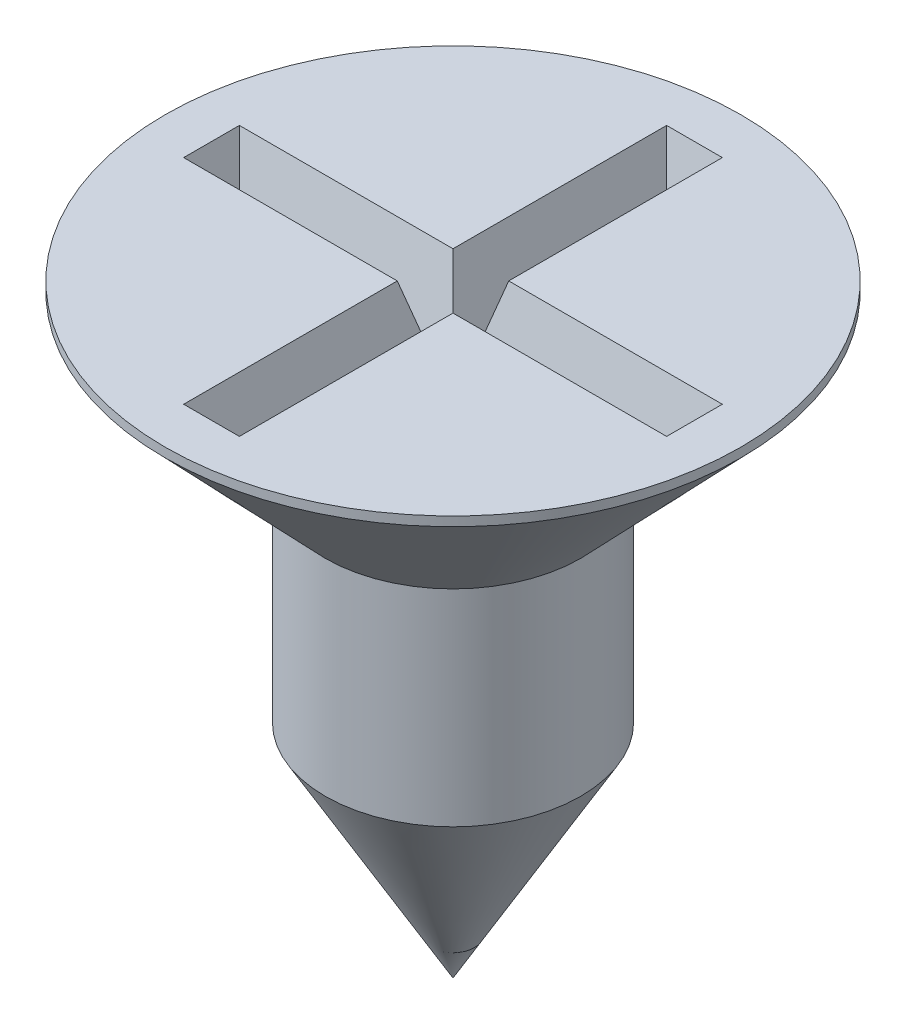
ISO-10303-21;
HEADER;
FILE_DESCRIPTION(('STEP AP214'),'2;1');
FILE_NAME('part.step','',(''),(''),'','','');
FILE_SCHEMA(('AUTOMOTIVE_DESIGN { 1 0 10303 214 1 1 1 1 }'));
ENDSEC;
DATA;
#1=APPLICATION_CONTEXT('core data for automotive mechanical design processes');
#2=APPLICATION_PROTOCOL_DEFINITION('international standard','automotive_design',2000,#1);
#3=PRODUCT_CONTEXT('',#1,'mechanical');
#4=PRODUCT('Part','Part','',(#3));
#5=PRODUCT_RELATED_PRODUCT_CATEGORY('part','',(#4));
#6=PRODUCT_DEFINITION_FORMATION('','',#4);
#7=PRODUCT_DEFINITION_CONTEXT('part definition',#1,'design');
#8=PRODUCT_DEFINITION('design','',#6,#7);
#9=PRODUCT_DEFINITION_SHAPE('','',#8);
#10=(LENGTH_UNIT() NAMED_UNIT(*) SI_UNIT(.MILLI.,.METRE.));
#11=(NAMED_UNIT(*) PLANE_ANGLE_UNIT() SI_UNIT($,.RADIAN.));
#12=(NAMED_UNIT(*) SI_UNIT($,.STERADIAN.) SOLID_ANGLE_UNIT());
#13=UNCERTAINTY_MEASURE_WITH_UNIT(LENGTH_MEASURE(1.E-05),#10,'distance_accuracy_value','');
#14=(GEOMETRIC_REPRESENTATION_CONTEXT(3) GLOBAL_UNCERTAINTY_ASSIGNED_CONTEXT((#13)) GLOBAL_UNIT_ASSIGNED_CONTEXT((#10,
#11,#12)) REPRESENTATION_CONTEXT('',''));
#15=CARTESIAN_POINT('',(0.,0.,0.));
#16=DIRECTION('',(0.,0.,1.));
#17=DIRECTION('',(1.,0.,0.));
#18=AXIS2_PLACEMENT_3D('',#15,#16,#17);
#19=CARTESIAN_POINT('',(0.,6.5,0.));
#20=DIRECTION('',(0.,-1.,0.));
#21=DIRECTION('',(0.,0.,-1.));
#22=AXIS2_PLACEMENT_3D('',#19,#20,#21);
#23=PLANE('',#22);
#24=DIRECTION('',(-1.,0.,0.));
#25=VECTOR('',#24,1.);
#26=CARTESIAN_POINT('',(5.19999999999999,6.5,-0.6));
#27=LINE('',#26,#25);
#28=CARTESIAN_POINT('',(5.19999999999999,6.5,-0.6));
#29=VERTEX_POINT('',#28);
#30=CARTESIAN_POINT('',(0.599999999999999,6.5,-0.6));
#31=VERTEX_POINT('',#30);
#32=EDGE_CURVE('E178',#29,#31,#27,.T.);
#33=ORIENTED_EDGE('',*,*,#32,.F.);
#34=DIRECTION('',(0.,0.,-1.));
#35=VECTOR('',#34,1.);
#36=CARTESIAN_POINT('',(5.19999999999999,6.5,-0.6));
#37=LINE('',#36,#35);
#38=CARTESIAN_POINT('',(5.19999999999999,6.5,0.6));
#39=VERTEX_POINT('',#38);
#40=EDGE_CURVE('E59',#39,#29,#37,.T.);
#41=ORIENTED_EDGE('',*,*,#40,.F.);
#42=DIRECTION('',(1.,0.,0.));
#43=VECTOR('',#42,1.);
#44=CARTESIAN_POINT('',(5.19999999999999,6.5,0.6));
#45=LINE('',#44,#43);
#46=CARTESIAN_POINT('',(0.599999999999999,6.5,0.6));
#47=VERTEX_POINT('',#46);
#48=EDGE_CURVE('E222',#47,#39,#45,.T.);
#49=ORIENTED_EDGE('',*,*,#48,.F.);
#50=DIRECTION('',(0.,0.,-1.));
#51=VECTOR('',#50,1.);
#52=CARTESIAN_POINT('',(0.6,6.5,5.19999999999999));
#53=LINE('',#52,#51);
#54=CARTESIAN_POINT('',(0.6,6.5,5.19999999999999));
#55=VERTEX_POINT('',#54);
#56=EDGE_CURVE('E218',#55,#47,#53,.T.);
#57=ORIENTED_EDGE('',*,*,#56,.F.);
#58=DIRECTION('',(1.,0.,0.));
#59=VECTOR('',#58,1.);
#60=CARTESIAN_POINT('',(0.6,6.5,5.19999999999999));
#61=LINE('',#60,#59);
#62=CARTESIAN_POINT('',(-0.6,6.5,5.19999999999999));
#63=VERTEX_POINT('',#62);
#64=EDGE_CURVE('E214',#63,#55,#61,.T.);
#65=ORIENTED_EDGE('',*,*,#64,.F.);
#66=DIRECTION('',(0.,0.,1.));
#67=VECTOR('',#66,1.);
#68=CARTESIAN_POINT('',(-0.6,6.5,5.19999999999999));
#69=LINE('',#68,#67);
#70=CARTESIAN_POINT('',(-0.6,6.5,0.6));
#71=VERTEX_POINT('',#70);
#72=EDGE_CURVE('E210',#71,#63,#69,.T.);
#73=ORIENTED_EDGE('',*,*,#72,.F.);
#74=DIRECTION('',(1.,0.,0.));
#75=VECTOR('',#74,1.);
#76=CARTESIAN_POINT('',(-0.6,6.5,0.6));
#77=LINE('',#76,#75);
#78=CARTESIAN_POINT('',(-5.19999999999999,6.5,0.6));
#79=VERTEX_POINT('',#78);
#80=EDGE_CURVE('E206',#79,#71,#77,.T.);
#81=ORIENTED_EDGE('',*,*,#80,.F.);
#82=DIRECTION('',(0.,0.,1.));
#83=VECTOR('',#82,1.);
#84=CARTESIAN_POINT('',(-5.19999999999999,6.5,-0.6));
#85=LINE('',#84,#83);
#86=CARTESIAN_POINT('',(-5.19999999999999,6.5,-0.6));
#87=VERTEX_POINT('',#86);
#88=EDGE_CURVE('E202',#87,#79,#85,.T.);
#89=ORIENTED_EDGE('',*,*,#88,.F.);
#90=DIRECTION('',(-1.,0.,0.));
#91=VECTOR('',#90,1.);
#92=CARTESIAN_POINT('',(-0.600000000000001,6.5,-0.6));
#93=LINE('',#92,#91);
#94=CARTESIAN_POINT('',(-0.600000000000001,6.5,-0.6));
#95=VERTEX_POINT('',#94);
#96=EDGE_CURVE('E198',#95,#87,#93,.T.);
#97=ORIENTED_EDGE('',*,*,#96,.F.);
#98=DIRECTION('',(0.,0.,1.));
#99=VECTOR('',#98,1.);
#100=CARTESIAN_POINT('',(-0.600000000000001,6.5,-0.6));
#101=LINE('',#100,#99);
#102=CARTESIAN_POINT('',(-0.600000000000001,6.5,-5.19999999999999));
#103=VERTEX_POINT('',#102);
#104=EDGE_CURVE('E191',#103,#95,#101,.T.);
#105=ORIENTED_EDGE('',*,*,#104,.F.);
#106=DIRECTION('',(-1.,0.,0.));
#107=VECTOR('',#106,1.);
#108=CARTESIAN_POINT('',(0.599999999999999,6.5,-5.19999999999999));
#109=LINE('',#108,#107);
#110=CARTESIAN_POINT('',(0.599999999999999,6.5,-5.19999999999999));
#111=VERTEX_POINT('',#110);
#112=EDGE_CURVE('E186',#111,#103,#109,.T.);
#113=ORIENTED_EDGE('',*,*,#112,.F.);
#114=DIRECTION('',(0.,0.,-1.));
#115=VECTOR('',#114,1.);
#116=CARTESIAN_POINT('',(0.599999999999999,6.5,-0.6));
#117=LINE('',#116,#115);
#118=EDGE_CURVE('E167',#31,#111,#117,.T.);
#119=ORIENTED_EDGE('',*,*,#118,.F.);
#120=EDGE_LOOP('',(#33,#41,#49,#57,#65,#73,#81,#89,#97,#105,#113,#119));
#121=FACE_BOUND('',#120,.T.);
#122=CARTESIAN_POINT('',(0.,6.5,0.));
#123=DIRECTION('',(0.,1.,0.));
#124=DIRECTION('',(0.,0.,1.));
#125=AXIS2_PLACEMENT_3D('',#122,#123,#124);
#126=CIRCLE('',#125,6.19999999999999);
#127=CARTESIAN_POINT('',(0.,6.5,6.19999999999999));
#128=VERTEX_POINT('',#127);
#129=EDGE_CURVE('E291',#128,#128,#126,.T.);
#130=ORIENTED_EDGE('',*,*,#129,.T.);
#131=EDGE_LOOP('',(#130));
#132=FACE_BOUND('',#131,.T.);
#133=ADVANCED_FACE('F39',(#121,#132),#23,.F.);
#134=CARTESIAN_POINT('',(0.,6.5,0.));
#135=DIRECTION('',(0.,1.,0.));
#136=DIRECTION('',(0.,0.,1.));
#137=AXIS2_PLACEMENT_3D('',#134,#135,#136);
#138=CYLINDRICAL_SURFACE('',#137,6.19999999999999);
#139=ORIENTED_EDGE('',*,*,#129,.F.);
#140=EDGE_LOOP('',(#139));
#141=FACE_BOUND('',#140,.T.);
#142=CARTESIAN_POINT('',(0.,6.3,0.));
#143=DIRECTION('',(0.,1.,0.));
#144=DIRECTION('',(0.,0.,1.));
#145=AXIS2_PLACEMENT_3D('',#142,#143,#144);
#146=CIRCLE('',#145,6.19999999999999);
#147=CARTESIAN_POINT('',(0.,6.3,6.19999999999999));
#148=VERTEX_POINT('',#147);
#149=EDGE_CURVE('E287',#148,#148,#146,.T.);
#150=ORIENTED_EDGE('',*,*,#149,.T.);
#151=EDGE_LOOP('',(#150));
#152=FACE_BOUND('',#151,.T.);
#153=ADVANCED_FACE('F456',(#141,#152),#138,.T.);
#154=CARTESIAN_POINT('',(0.,2.7,0.));
#155=DIRECTION('',(0.,1.,0.));
#156=DIRECTION('',(0.,0.,1.));
#157=AXIS2_PLACEMENT_3D('',#154,#155,#156);
#158=CONICAL_SURFACE('',#157,2.74999999999999,0.764124777373387);
#159=CARTESIAN_POINT('',(4.56973881140884,4.5998,0.0908429445423794));
#160=CARTESIAN_POINT('',(4.67503828420214,4.71029873744425,0.120450992005224));
#161=CARTESIAN_POINT('',(4.78022645620089,4.82089604868346,0.150085452236824));
#162=CARTESIAN_POINT('',(4.99038018570394,5.04228780515629,0.209407194594628));
#163=CARTESIAN_POINT('',(5.09534574323556,5.1530822503657,0.239094476714344));
#164=CARTESIAN_POINT('',(5.20019999999999,5.26397526934586,0.268808171596327));
#165=B_SPLINE_CURVE_WITH_KNOTS('',3,(#159,#160,#161,#162,#163,#164),.UNSPECIFIED.,.F.,.F.,(4,2,
4),(0.,0.466444704263011,0.93288935123795),.UNSPECIFIED.);
#166=CARTESIAN_POINT('',(4.56992945034698,4.6,0.0908965343808655));
#167=VERTEX_POINT('',#166);
#168=CARTESIAN_POINT('',(4.73827792700708,4.77682976461443,0.138277927007089));
#169=VERTEX_POINT('',#168);
#170=EDGE_CURVE('E52',#167,#169,#165,.T.);
#171=ORIENTED_EDGE('',*,*,#170,.T.);
#172=CARTESIAN_POINT('',(4.75214750465496,4.82859173307583,0.6002));
#173=CARTESIAN_POINT('',(4.74731094026299,4.81054142903092,0.50090084970078));
#174=CARTESIAN_POINT('',(4.74363678763936,4.79682930476477,0.400717092167328));
#175=CARTESIAN_POINT('',(4.73873941003317,4.77855204271462,0.200350434962483));
#176=CARTESIAN_POINT('',(4.7374949943619,4.77390782020372,0.100175217481241));
#177=CARTESIAN_POINT('',(4.7374949943619,4.77390782020372,-0.100175217481241));
#178=CARTESIAN_POINT('',(4.73873941003317,4.77855204271462,-0.200350434962483));
#179=CARTESIAN_POINT('',(4.74363678763936,4.79682930476477,-0.400717092167328));
#180=CARTESIAN_POINT('',(4.74731094026299,4.81054142903092,-0.50090084970078));
#181=CARTESIAN_POINT('',(4.75214750465496,4.82859173307583,-0.6002));
#182=B_SPLINE_CURVE_WITH_KNOTS('',3,(#172,#173,#174,#175,#176,#177,#178,#179,#180,#181),
.UNSPECIFIED.,.F.,.F.,(4,2,2,2,4),(0.,0.303085396279077,0.60351544594977,0.903945495620462,
1.20703089189954),.UNSPECIFIED.);
#183=CARTESIAN_POINT('',(4.73827792700708,4.77682976461443,-0.138277927007089));
#184=VERTEX_POINT('',#183);
#185=EDGE_CURVE('E11',#169,#184,#182,.T.);
#186=ORIENTED_EDGE('',*,*,#185,.T.);
#187=CARTESIAN_POINT('',(5.20019999999999,5.26397526934586,-0.268808171596326));
#188=CARTESIAN_POINT('',(5.09534574323556,5.1530822503657,-0.239094476714344));
#189=CARTESIAN_POINT('',(4.99038018570394,5.04228780515629,-0.209407194594628));
#190=CARTESIAN_POINT('',(4.78022645620089,4.82089604868346,-0.150085452236824));
#191=CARTESIAN_POINT('',(4.67503828420214,4.71029873744425,-0.120450992005224));
#192=CARTESIAN_POINT('',(4.56973881140884,4.5998,-0.0908429445423793));
#193=B_SPLINE_CURVE_WITH_KNOTS('',3,(#187,#188,#189,#190,#191,#192),.UNSPECIFIED.,.F.,.F.,(4,2,
4),(0.,0.466444646974939,0.93288935123795),.UNSPECIFIED.);
#194=CARTESIAN_POINT('',(4.56992945034698,4.6,-0.0908965343808655));
#195=VERTEX_POINT('',#194);
#196=EDGE_CURVE('E400',#184,#195,#193,.T.);
#197=ORIENTED_EDGE('',*,*,#196,.T.);
#198=CARTESIAN_POINT('',(0.,4.6,0.));
#199=DIRECTION('',(0.,-1.,0.));
#200=DIRECTION('',(0.,0.,-1.));
#201=AXIS2_PLACEMENT_3D('',#198,#199,#200);
#202=CIRCLE('',#201,4.57083333333332);
#203=EDGE_CURVE('E299',#195,#167,#202,.T.);
#204=ORIENTED_EDGE('',*,*,#203,.T.);
#205=EDGE_LOOP('',(#171,#186,#197,#204));
#206=FACE_BOUND('',#205,.T.);
#207=CARTESIAN_POINT('',(-0.6002,4.82859173307584,4.75214750465496));
#208=CARTESIAN_POINT('',(-0.50090084970078,4.81054142903094,4.74731094026299));
#209=CARTESIAN_POINT('',(-0.400717092167328,4.79682930476479,4.74363678763936));
#210=CARTESIAN_POINT('',(-0.200350434962482,4.77855204271463,4.73873941003317));
#211=CARTESIAN_POINT('',(-0.100175217481241,4.77390782020374,4.73749499436191));
#212=CARTESIAN_POINT('',(0.100175217481242,4.77390782020374,4.73749499436191));
#213=CARTESIAN_POINT('',(0.200350434962483,4.77855204271463,4.73873941003317));
#214=CARTESIAN_POINT('',(0.400717092167328,4.79682930476479,4.74363678763936));
#215=CARTESIAN_POINT('',(0.500900849700781,4.81054142903093,4.74731094026299));
#216=CARTESIAN_POINT('',(0.6002,4.82859173307584,4.75214750465496));
#217=B_SPLINE_CURVE_WITH_KNOTS('',3,(#207,#208,#209,#210,#211,#212,#213,#214,#215,#216),
.UNSPECIFIED.,.F.,.F.,(4,2,2,2,4),(0.,0.303085396279077,0.60351544594977,0.903945495620462,
1.20703089189954),.UNSPECIFIED.);
#218=CARTESIAN_POINT('',(-0.138277927007092,4.77682976461444,4.73827792700708));
#219=VERTEX_POINT('',#218);
#220=CARTESIAN_POINT('',(0.138277927007092,4.77682976461444,4.73827792700708));
#221=VERTEX_POINT('',#220);
#222=EDGE_CURVE('E385',#219,#221,#217,.T.);
#223=ORIENTED_EDGE('',*,*,#222,.T.);
#224=CARTESIAN_POINT('',(0.268808171596329,5.26397526934587,5.20019999999999));
#225=CARTESIAN_POINT('',(0.239094476714346,5.15308225036571,5.09534574323556));
#226=CARTESIAN_POINT('',(0.20940719459463,5.0422878051563,4.99038018570393));
#227=CARTESIAN_POINT('',(0.150085452236825,4.82089604868346,4.78022645620089));
#228=CARTESIAN_POINT('',(0.120450992005225,4.71029873744425,4.67503828420213));
#229=CARTESIAN_POINT('',(0.0908429445423795,4.5998,4.56973881140884));
#230=B_SPLINE_CURVE_WITH_KNOTS('',3,(#224,#225,#226,#227,#228,#229),.UNSPECIFIED.,.F.,.F.,(4,2,
4),(0.,0.466444646974946,0.932889351237963),.UNSPECIFIED.);
#231=CARTESIAN_POINT('',(0.0908965343808657,4.6,4.56992945034697));
#232=VERTEX_POINT('',#231);
#233=EDGE_CURVE('E393',#221,#232,#230,.T.);
#234=ORIENTED_EDGE('',*,*,#233,.T.);
#235=CARTESIAN_POINT('',(-0.0908965343808655,4.6,4.56992945034697));
#236=VERTEX_POINT('',#235);
#237=EDGE_CURVE('E386',#232,#236,#202,.T.);
#238=ORIENTED_EDGE('',*,*,#237,.T.);
#239=CARTESIAN_POINT('',(-0.0908429445423793,4.5998,4.56973881140884));
#240=CARTESIAN_POINT('',(-0.120450992005225,4.71029873744425,4.67503828420213));
#241=CARTESIAN_POINT('',(-0.150085452236825,4.82089604868346,4.78022645620089));
#242=CARTESIAN_POINT('',(-0.20940719459463,5.0422878051563,4.99038018570393));
#243=CARTESIAN_POINT('',(-0.239094476714346,5.15308225036571,5.09534574323556));
#244=CARTESIAN_POINT('',(-0.268808171596329,5.26397526934587,5.20019999999999));
#245=B_SPLINE_CURVE_WITH_KNOTS('',3,(#239,#240,#241,#242,#243,#244),.UNSPECIFIED.,.F.,.F.,(4,2,
4),(0.,0.466444704263017,0.932889351237963),.UNSPECIFIED.);
#246=EDGE_CURVE('E378',#236,#219,#245,.T.);
#247=ORIENTED_EDGE('',*,*,#246,.T.);
#248=EDGE_LOOP('',(#223,#234,#238,#247));
#249=FACE_BOUND('',#248,.T.);
#250=CARTESIAN_POINT('',(-4.75214750465497,4.82859173307585,-0.6002));
#251=CARTESIAN_POINT('',(-4.747310940263,4.81054142903095,-0.50090084970078));
#252=CARTESIAN_POINT('',(-4.74363678763937,4.7968293047648,-0.400717092167328));
#253=CARTESIAN_POINT('',(-4.73873941003318,4.77855204271465,-0.200350434962483));
#254=CARTESIAN_POINT('',(-4.73749499436191,4.77390782020375,-0.100175217481241));
#255=CARTESIAN_POINT('',(-4.73749499436191,4.77390782020375,0.100175217481241));
#256=CARTESIAN_POINT('',(-4.73873941003318,4.77855204271465,0.200350434962483));
#257=CARTESIAN_POINT('',(-4.74363678763937,4.7968293047648,0.400717092167328));
#258=CARTESIAN_POINT('',(-4.747310940263,4.81054142903095,0.50090084970078));
#259=CARTESIAN_POINT('',(-4.75214750465497,4.82859173307586,0.6002));
#260=B_SPLINE_CURVE_WITH_KNOTS('',3,(#250,#251,#252,#253,#254,#255,#256,#257,#258,#259),
.UNSPECIFIED.,.F.,.F.,(4,2,2,2,4),(0.,0.303085396279077,0.603515445949769,0.903945495620462,
1.20703089189954),.UNSPECIFIED.);
#261=CARTESIAN_POINT('',(-4.73827792700709,4.77682976461446,-0.138277927007095));
#262=VERTEX_POINT('',#261);
#263=CARTESIAN_POINT('',(-4.73827792700709,4.77682976461446,0.138277927007096));
#264=VERTEX_POINT('',#263);
#265=EDGE_CURVE('E348',#262,#264,#260,.T.);
#266=ORIENTED_EDGE('',*,*,#265,.T.);
#267=CARTESIAN_POINT('',(-5.20019999999999,5.26397526934588,0.268808171596332));
#268=CARTESIAN_POINT('',(-5.09534574323556,5.15308225036572,0.239094476714348));
#269=CARTESIAN_POINT('',(-4.99038018570393,5.0422878051563,0.209407194594632));
#270=CARTESIAN_POINT('',(-4.78022645620088,4.82089604868346,0.150085452236826));
#271=CARTESIAN_POINT('',(-4.67503828420212,4.71029873744425,0.120450992005225));
#272=CARTESIAN_POINT('',(-4.56973881140883,4.5998,0.0908429445423795));
#273=B_SPLINE_CURVE_WITH_KNOTS('',3,(#267,#268,#269,#270,#271,#272),.UNSPECIFIED.,.F.,.F.,(4,2,
4),(0.,0.466444646974954,0.932889351237978),.UNSPECIFIED.);
#274=CARTESIAN_POINT('',(-4.56992945034696,4.6,0.0908965343808655));
#275=VERTEX_POINT('',#274);
#276=EDGE_CURVE('E355',#264,#275,#273,.T.);
#277=ORIENTED_EDGE('',*,*,#276,.T.);
#278=CARTESIAN_POINT('',(-4.56992945034696,4.6,-0.0908965343808656));
#279=VERTEX_POINT('',#278);
#280=EDGE_CURVE('E300',#275,#279,#202,.T.);
#281=ORIENTED_EDGE('',*,*,#280,.T.);
#282=CARTESIAN_POINT('',(-4.56973881140883,4.5998,-0.0908429445423795));
#283=CARTESIAN_POINT('',(-4.67503828420212,4.71029873744425,-0.120450992005225));
#284=CARTESIAN_POINT('',(-4.78022645620088,4.82089604868346,-0.150085452236826));
#285=CARTESIAN_POINT('',(-4.99038018570393,5.04228780515631,-0.209407194594632));
#286=CARTESIAN_POINT('',(-5.09534574323556,5.15308225036572,-0.239094476714348));
#287=CARTESIAN_POINT('',(-5.20019999999999,5.26397526934588,-0.268808171596332));
#288=B_SPLINE_CURVE_WITH_KNOTS('',3,(#282,#283,#284,#285,#286,#287),.UNSPECIFIED.,.F.,.F.,(4,2,
4),(0.,0.466444704263025,0.932889351237978),.UNSPECIFIED.);
#289=EDGE_CURVE('E341',#279,#262,#288,.T.);
#290=ORIENTED_EDGE('',*,*,#289,.T.);
#291=EDGE_LOOP('',(#266,#277,#281,#290));
#292=FACE_BOUND('',#291,.T.);
#293=CARTESIAN_POINT('',(0.600199999999999,4.82859173307584,-4.75214750465496));
#294=CARTESIAN_POINT('',(0.500900849700779,4.81054142903093,-4.74731094026299));
#295=CARTESIAN_POINT('',(0.400717092167327,4.79682930476479,-4.74363678763936));
#296=CARTESIAN_POINT('',(0.200350434962482,4.77855204271463,-4.73873941003317));
#297=CARTESIAN_POINT('',(0.10017521748124,4.77390782020374,-4.73749499436191));
#298=CARTESIAN_POINT('',(-0.100175217481242,4.77390782020374,-4.73749499436191));
#299=CARTESIAN_POINT('',(-0.200350434962484,4.77855204271463,-4.73873941003317));
#300=CARTESIAN_POINT('',(-0.400717092167329,4.79682930476479,-4.74363678763936));
#301=CARTESIAN_POINT('',(-0.500900849700781,4.81054142903094,-4.74731094026299));
#302=CARTESIAN_POINT('',(-0.600200000000001,4.82859173307584,-4.75214750465496));
#303=B_SPLINE_CURVE_WITH_KNOTS('',3,(#293,#294,#295,#296,#297,#298,#299,#300,#301,#302),
.UNSPECIFIED.,.F.,.F.,(4,2,2,2,4),(0.,0.303085396279077,0.60351544594977,0.903945495620462,
1.20703089189954),.UNSPECIFIED.);
#304=CARTESIAN_POINT('',(0.138277927007091,4.77682976461445,-4.73827792700708));
#305=VERTEX_POINT('',#304);
#306=CARTESIAN_POINT('',(-0.138277927007094,4.77682976461445,-4.73827792700709));
#307=VERTEX_POINT('',#306);
#308=EDGE_CURVE('E308',#305,#307,#303,.T.);
#309=ORIENTED_EDGE('',*,*,#308,.T.);
#310=CARTESIAN_POINT('',(-0.268808171596331,5.26397526934587,-5.20019999999999));
#311=CARTESIAN_POINT('',(-0.239094476714347,5.15308225036571,-5.09534574323556));
#312=CARTESIAN_POINT('',(-0.209407194594631,5.0422878051563,-4.99038018570394));
#313=CARTESIAN_POINT('',(-0.150085452236826,4.82089604868346,-4.78022645620089));
#314=CARTESIAN_POINT('',(-0.120450992005226,4.71029873744425,-4.67503828420213));
#315=CARTESIAN_POINT('',(-0.0908429445423804,4.5998,-4.56973881140884));
#316=B_SPLINE_CURVE_WITH_KNOTS('',3,(#310,#311,#312,#313,#314,#315),.UNSPECIFIED.,.F.,.F.,(4,2,
4),(0.,0.466444646974947,0.932889351237965),.UNSPECIFIED.);
#317=CARTESIAN_POINT('',(-0.0908965343808665,4.6,-4.56992945034697));
#318=VERTEX_POINT('',#317);
#319=EDGE_CURVE('E334',#307,#318,#316,.T.);
#320=ORIENTED_EDGE('',*,*,#319,.T.);
#321=CARTESIAN_POINT('',(0.0908965343808646,4.6,-4.56992945034697));
#322=VERTEX_POINT('',#321);
#323=EDGE_CURVE('E294',#318,#322,#202,.T.);
#324=ORIENTED_EDGE('',*,*,#323,.T.);
#325=CARTESIAN_POINT('',(0.0908429445423786,4.5998,-4.56973881140884));
#326=CARTESIAN_POINT('',(0.120450992005224,4.71029873744425,-4.67503828420213));
#327=CARTESIAN_POINT('',(0.150085452236824,4.82089604868346,-4.78022645620089));
#328=CARTESIAN_POINT('',(0.209407194594629,5.0422878051563,-4.99038018570394));
#329=CARTESIAN_POINT('',(0.239094476714345,5.15308225036571,-5.09534574323556));
#330=CARTESIAN_POINT('',(0.268808171596328,5.26397526934587,-5.20019999999999));
#331=B_SPLINE_CURVE_WITH_KNOTS('',3,(#325,#326,#327,#328,#329,#330),.UNSPECIFIED.,.F.,.F.,(4,2,
4),(0.,0.466444704263018,0.932889351237964),.UNSPECIFIED.);
#332=EDGE_CURVE('E298',#322,#305,#331,.T.);
#333=ORIENTED_EDGE('',*,*,#332,.T.);
#334=EDGE_LOOP('',(#309,#320,#324,#333));
#335=FACE_BOUND('',#334,.T.);
#336=ORIENTED_EDGE('',*,*,#149,.F.);
#337=EDGE_LOOP('',(#336));
#338=FACE_BOUND('',#337,.T.);
#339=CARTESIAN_POINT('',(0.,2.7,0.));
#340=DIRECTION('',(0.,1.,0.));
#341=DIRECTION('',(0.,0.,1.));
#342=AXIS2_PLACEMENT_3D('',#339,#340,#341);
#343=CIRCLE('',#342,2.74999999999999);
#344=CARTESIAN_POINT('',(0.,2.7,2.74999999999999));
#345=VERTEX_POINT('',#344);
#346=EDGE_CURVE('E283',#345,#345,#343,.T.);
#347=ORIENTED_EDGE('',*,*,#346,.T.);
#348=EDGE_LOOP('',(#347));
#349=FACE_BOUND('',#348,.T.);
#350=ADVANCED_FACE('F314',(#206,#249,#292,#335,#338,#349),#158,.T.);
#351=CARTESIAN_POINT('',(0.,6.5,0.));
#352=DIRECTION('',(0.,1.,0.));
#353=DIRECTION('',(0.,0.,1.));
#354=AXIS2_PLACEMENT_3D('',#351,#352,#353);
#355=CYLINDRICAL_SURFACE('',#354,2.74999999999999);
#356=ORIENTED_EDGE('',*,*,#346,.F.);
#357=EDGE_LOOP('',(#356));
#358=FACE_BOUND('',#357,.T.);
#359=CARTESIAN_POINT('',(0.,-1.73686027918561,0.));
#360=DIRECTION('',(0.,1.,0.));
#361=DIRECTION('',(0.,0.,1.));
#362=AXIS2_PLACEMENT_3D('',#359,#360,#361);
#363=CIRCLE('',#362,2.74999999999999);
#364=CARTESIAN_POINT('',(0.,-1.73686027918561,2.74999999999999));
#365=VERTEX_POINT('',#364);
#366=EDGE_CURVE('E230',#365,#365,#363,.T.);
#367=ORIENTED_EDGE('',*,*,#366,.T.);
#368=EDGE_LOOP('',(#367));
#369=FACE_BOUND('',#368,.T.);
#370=ADVANCED_FACE('F455',(#358,#369),#355,.T.);
#371=CARTESIAN_POINT('',(0.,-6.5,0.));
#372=DIRECTION('',(0.,1.,0.));
#373=DIRECTION('',(0.,0.,1.));
#374=AXIS2_PLACEMENT_3D('',#371,#372,#373);
#375=CONICAL_SURFACE('',#374,0.,0.5235987755983);
#376=ORIENTED_EDGE('',*,*,#366,.F.);
#377=EDGE_LOOP('',(#376));
#378=FACE_BOUND('',#377,.T.);
#379=CARTESIAN_POINT('',(0.,-6.5,0.));
#380=VERTEX_POINT('',#379);
#381=VERTEX_LOOP('',#380);
#382=FACE_BOUND('',#381,.T.);
#383=ADVANCED_FACE('F415',(#378,#382),#375,.T.);
#384=CARTESIAN_POINT('',(5.19999999999999,6.5,-0.6));
#385=DIRECTION('',(0.965925826289068,-0.258819045102521,0.));
#386=DIRECTION('',(0.258819045102521,0.965925826289068,0.));
#387=AXIS2_PLACEMENT_3D('',#384,#385,#386);
#388=PLANE('',#387);
#389=DIRECTION('',(0.250562807085732,0.935113126531029,0.250562807085732));
#390=VECTOR('',#389,1.);
#391=CARTESIAN_POINT('',(5.19999999999999,6.5,0.6));
#392=LINE('',#391,#390);
#393=EDGE_CURVE('E227',#169,#39,#392,.T.);
#394=ORIENTED_EDGE('',*,*,#393,.T.);
#395=ORIENTED_EDGE('',*,*,#40,.T.);
#396=DIRECTION('',(0.250562807085732,0.935113126531029,-0.250562807085732));
#397=VECTOR('',#396,1.);
#398=CARTESIAN_POINT('',(5.19999999999999,6.5,-0.6));
#399=LINE('',#398,#397);
#400=EDGE_CURVE('E175',#184,#29,#399,.T.);
#401=ORIENTED_EDGE('',*,*,#400,.F.);
#402=ORIENTED_EDGE('',*,*,#185,.F.);
#403=EDGE_LOOP('',(#394,#395,#401,#402));
#404=FACE_BOUND('',#403,.T.);
#405=ADVANCED_FACE('F413',(#404),#388,.F.);
#406=CARTESIAN_POINT('',(5.19999999999999,6.5,0.6));
#407=DIRECTION('',(0.,-0.258819045102521,0.965925826289068));
#408=DIRECTION('',(0.,-0.965925826289068,-0.258819045102521));
#409=AXIS2_PLACEMENT_3D('',#406,#407,#408);
#410=PLANE('',#409);
#411=DIRECTION('',(1.,0.,0.));
#412=VECTOR('',#411,1.);
#413=CARTESIAN_POINT('',(5.19999999999999,4.6,0.0908965343808655));
#414=LINE('',#413,#412);
#415=CARTESIAN_POINT('',(0.090896534380865,4.6,0.0908965343808655));
#416=VERTEX_POINT('',#415);
#417=EDGE_CURVE('E67',#416,#167,#414,.T.);
#418=ORIENTED_EDGE('',*,*,#417,.F.);
#419=DIRECTION('',(0.250562807085732,0.935113126531029,0.250562807085732));
#420=VECTOR('',#419,1.);
#421=CARTESIAN_POINT('',(0.888795913355536,7.57780102166112,0.888795913355536));
#422=LINE('',#421,#420);
#423=EDGE_CURVE('E231',#416,#47,#422,.T.);
#424=ORIENTED_EDGE('',*,*,#423,.T.);
#425=ORIENTED_EDGE('',*,*,#48,.T.);
#426=ORIENTED_EDGE('',*,*,#393,.F.);
#427=ORIENTED_EDGE('',*,*,#170,.F.);
#428=EDGE_LOOP('',(#418,#424,#425,#426,#427));
#429=FACE_BOUND('',#428,.T.);
#430=ADVANCED_FACE('F408',(#429),#410,.F.);
#431=CARTESIAN_POINT('',(0.6,6.5,5.19999999999999));
#432=DIRECTION('',(0.965925826289068,-0.258819045102521,0.));
#433=DIRECTION('',(0.258819045102521,0.965925826289068,0.));
#434=AXIS2_PLACEMENT_3D('',#431,#432,#433);
#435=PLANE('',#434);
#436=DIRECTION('',(0.250562807085732,0.935113126531029,0.250562807085732));
#437=VECTOR('',#436,1.);
#438=CARTESIAN_POINT('',(0.6,6.5,5.19999999999999));
#439=LINE('',#438,#437);
#440=EDGE_CURVE('E254',#221,#55,#439,.T.);
#441=ORIENTED_EDGE('',*,*,#440,.T.);
#442=ORIENTED_EDGE('',*,*,#56,.T.);
#443=ORIENTED_EDGE('',*,*,#423,.F.);
#444=DIRECTION('',(0.,0.,-1.));
#445=VECTOR('',#444,1.);
#446=CARTESIAN_POINT('',(0.0908965343808659,4.6,5.19999999999999));
#447=LINE('',#446,#445);
#448=EDGE_CURVE('E261',#232,#416,#447,.T.);
#449=ORIENTED_EDGE('',*,*,#448,.F.);
#450=ORIENTED_EDGE('',*,*,#233,.F.);
#451=EDGE_LOOP('',(#441,#442,#443,#449,#450));
#452=FACE_BOUND('',#451,.T.);
#453=ADVANCED_FACE('F404',(#452),#435,.F.);
#454=CARTESIAN_POINT('',(0.6,6.5,5.19999999999999));
#455=DIRECTION('',(0.,-0.258819045102521,0.965925826289068));
#456=DIRECTION('',(0.,-0.965925826289068,-0.258819045102521));
#457=AXIS2_PLACEMENT_3D('',#454,#455,#456);
#458=PLANE('',#457);
#459=DIRECTION('',(-0.250562807085732,0.935113126531029,0.250562807085732));
#460=VECTOR('',#459,1.);
#461=CARTESIAN_POINT('',(-0.6,6.5,5.19999999999999));
#462=LINE('',#461,#460);
#463=EDGE_CURVE('E251',#219,#63,#462,.T.);
#464=ORIENTED_EDGE('',*,*,#463,.T.);
#465=ORIENTED_EDGE('',*,*,#64,.T.);
#466=ORIENTED_EDGE('',*,*,#440,.F.);
#467=ORIENTED_EDGE('',*,*,#222,.F.);
#468=EDGE_LOOP('',(#464,#465,#466,#467));
#469=FACE_BOUND('',#468,.T.);
#470=ADVANCED_FACE('F374',(#469),#458,.F.);
#471=CARTESIAN_POINT('',(-0.6,6.5,5.19999999999999));
#472=DIRECTION('',(-0.965925826289068,-0.258819045102521,0.));
#473=DIRECTION('',(0.258819045102521,-0.965925826289068,0.));
#474=AXIS2_PLACEMENT_3D('',#471,#472,#473);
#475=PLANE('',#474);
#476=DIRECTION('',(0.,0.,1.));
#477=VECTOR('',#476,1.);
#478=CARTESIAN_POINT('',(-0.0908965343808654,4.6,5.19999999999999));
#479=LINE('',#478,#477);
#480=CARTESIAN_POINT('',(-0.090896534380866,4.6,0.0908965343808655));
#481=VERTEX_POINT('',#480);
#482=EDGE_CURVE('E264',#481,#236,#479,.T.);
#483=ORIENTED_EDGE('',*,*,#482,.F.);
#484=DIRECTION('',(-0.250562807085732,0.935113126531029,0.250562807085732));
#485=VECTOR('',#484,1.);
#486=CARTESIAN_POINT('',(-0.888795913355536,7.57780102166111,0.888795913355536));
#487=LINE('',#486,#485);
#488=EDGE_CURVE('E248',#481,#71,#487,.T.);
#489=ORIENTED_EDGE('',*,*,#488,.T.);
#490=ORIENTED_EDGE('',*,*,#72,.T.);
#491=ORIENTED_EDGE('',*,*,#463,.F.);
#492=ORIENTED_EDGE('',*,*,#246,.F.);
#493=EDGE_LOOP('',(#483,#489,#490,#491,#492));
#494=FACE_BOUND('',#493,.T.);
#495=ADVANCED_FACE('F369',(#494),#475,.F.);
#496=CARTESIAN_POINT('',(-0.6,6.5,0.6));
#497=DIRECTION('',(0.,-0.258819045102521,0.965925826289068));
#498=DIRECTION('',(0.,-0.965925826289068,-0.258819045102521));
#499=AXIS2_PLACEMENT_3D('',#496,#497,#498);
#500=PLANE('',#499);
#501=DIRECTION('',(-0.250562807085732,0.935113126531029,0.250562807085732));
#502=VECTOR('',#501,1.);
#503=CARTESIAN_POINT('',(-5.12466193564637,6.2188345160884,0.524661935646382));
#504=LINE('',#503,#502);
#505=EDGE_CURVE('E245',#264,#79,#504,.T.);
#506=ORIENTED_EDGE('',*,*,#505,.T.);
#507=ORIENTED_EDGE('',*,*,#80,.T.);
#508=ORIENTED_EDGE('',*,*,#488,.F.);
#509=DIRECTION('',(1.,0.,0.));
#510=VECTOR('',#509,1.);
#511=CARTESIAN_POINT('',(-0.6,4.6,0.0908965343808655));
#512=LINE('',#511,#510);
#513=EDGE_CURVE('E267',#275,#481,#512,.T.);
#514=ORIENTED_EDGE('',*,*,#513,.F.);
#515=ORIENTED_EDGE('',*,*,#276,.F.);
#516=EDGE_LOOP('',(#506,#507,#508,#514,#515));
#517=FACE_BOUND('',#516,.T.);
#518=ADVANCED_FACE('F364',(#517),#500,.F.);
#519=CARTESIAN_POINT('',(-5.19999999999999,6.5,-0.6));
#520=DIRECTION('',(-0.965925826289068,-0.258819045102521,0.));
#521=DIRECTION('',(0.258819045102521,-0.965925826289068,0.));
#522=AXIS2_PLACEMENT_3D('',#519,#520,#521);
#523=PLANE('',#522);
#524=DIRECTION('',(-0.250562807085732,0.935113126531029,-0.250562807085732));
#525=VECTOR('',#524,1.);
#526=CARTESIAN_POINT('',(-4.91120408664446,5.42219897833888,-0.311204086644464));
#527=LINE('',#526,#525);
#528=EDGE_CURVE('E242',#262,#87,#527,.T.);
#529=ORIENTED_EDGE('',*,*,#528,.T.);
#530=ORIENTED_EDGE('',*,*,#88,.T.);
#531=ORIENTED_EDGE('',*,*,#505,.F.);
#532=ORIENTED_EDGE('',*,*,#265,.F.);
#533=EDGE_LOOP('',(#529,#530,#531,#532));
#534=FACE_BOUND('',#533,.T.);
#535=ADVANCED_FACE('F361',(#534),#523,.F.);
#536=CARTESIAN_POINT('',(-0.600000000000001,6.5,-0.6));
#537=DIRECTION('',(0.,-0.258819045102521,-0.965925826289068));
#538=DIRECTION('',(0.,0.965925826289068,-0.258819045102521));
#539=AXIS2_PLACEMENT_3D('',#536,#537,#538);
#540=PLANE('',#539);
#541=DIRECTION('',(-1.,0.,0.));
#542=VECTOR('',#541,1.);
#543=CARTESIAN_POINT('',(-0.600000000000001,4.6,-0.0908965343808655));
#544=LINE('',#543,#542);
#545=CARTESIAN_POINT('',(-0.0908965343808661,4.6,-0.0908965343808655));
#546=VERTEX_POINT('',#545);
#547=EDGE_CURVE('E270',#546,#279,#544,.T.);
#548=ORIENTED_EDGE('',*,*,#547,.F.);
#549=DIRECTION('',(-0.250562807085732,0.935113126531029,-0.250562807085732));
#550=VECTOR('',#549,1.);
#551=CARTESIAN_POINT('',(-0.600000000000001,6.5,-0.6));
#552=LINE('',#551,#550);
#553=EDGE_CURVE('E239',#546,#95,#552,.T.);
#554=ORIENTED_EDGE('',*,*,#553,.T.);
#555=ORIENTED_EDGE('',*,*,#96,.T.);
#556=ORIENTED_EDGE('',*,*,#528,.F.);
#557=ORIENTED_EDGE('',*,*,#289,.F.);
#558=EDGE_LOOP('',(#548,#554,#555,#556,#557));
#559=FACE_BOUND('',#558,.T.);
#560=ADVANCED_FACE('F330',(#559),#540,.F.);
#561=CARTESIAN_POINT('',(-0.600000000000001,6.5,-0.6));
#562=DIRECTION('',(-0.965925826289068,-0.258819045102521,0.));
#563=DIRECTION('',(0.258819045102521,-0.965925826289068,0.));
#564=AXIS2_PLACEMENT_3D('',#561,#562,#563);
#565=PLANE('',#564);
#566=DIRECTION('',(-0.250562807085732,0.935113126531029,-0.250562807085732));
#567=VECTOR('',#566,1.);
#568=CARTESIAN_POINT('',(-0.524661935646383,6.2188345160884,-5.12466193564637));
#569=LINE('',#568,#567);
#570=EDGE_CURVE('E236',#307,#103,#569,.T.);
#571=ORIENTED_EDGE('',*,*,#570,.T.);
#572=ORIENTED_EDGE('',*,*,#104,.T.);
#573=ORIENTED_EDGE('',*,*,#553,.F.);
#574=DIRECTION('',(0.,0.,1.));
#575=VECTOR('',#574,1.);
#576=CARTESIAN_POINT('',(-0.0908965343808661,4.6,-0.6));
#577=LINE('',#576,#575);
#578=EDGE_CURVE('E273',#318,#546,#577,.T.);
#579=ORIENTED_EDGE('',*,*,#578,.F.);
#580=ORIENTED_EDGE('',*,*,#319,.F.);
#581=EDGE_LOOP('',(#571,#572,#573,#579,#580));
#582=FACE_BOUND('',#581,.T.);
#583=ADVANCED_FACE('F325',(#582),#565,.F.);
#584=CARTESIAN_POINT('',(0.599999999999999,6.5,-5.19999999999999));
#585=DIRECTION('',(0.,-0.258819045102521,-0.965925826289068));
#586=DIRECTION('',(0.,0.965925826289068,-0.258819045102521));
#587=AXIS2_PLACEMENT_3D('',#584,#585,#586);
#588=PLANE('',#587);
#589=DIRECTION('',(0.250562807085732,0.935113126531029,-0.250562807085732));
#590=VECTOR('',#589,1.);
#591=CARTESIAN_POINT('',(0.311204086644463,5.42219897833888,-4.91120408664446));
#592=LINE('',#591,#590);
#593=EDGE_CURVE('E174',#305,#111,#592,.T.);
#594=ORIENTED_EDGE('',*,*,#593,.T.);
#595=ORIENTED_EDGE('',*,*,#112,.T.);
#596=ORIENTED_EDGE('',*,*,#570,.F.);
#597=ORIENTED_EDGE('',*,*,#308,.F.);
#598=EDGE_LOOP('',(#594,#595,#596,#597));
#599=FACE_BOUND('',#598,.T.);
#600=ADVANCED_FACE('F320',(#599),#588,.F.);
#601=CARTESIAN_POINT('',(0.599999999999999,6.5,-0.6));
#602=DIRECTION('',(0.965925826289068,-0.258819045102521,0.));
#603=DIRECTION('',(0.258819045102521,0.965925826289068,0.));
#604=AXIS2_PLACEMENT_3D('',#601,#602,#603);
#605=PLANE('',#604);
#606=DIRECTION('',(0.,0.,-1.));
#607=VECTOR('',#606,1.);
#608=CARTESIAN_POINT('',(0.090896534380865,4.6,-0.6));
#609=LINE('',#608,#607);
#610=CARTESIAN_POINT('',(0.090896534380865,4.6,-0.0908965343808655));
#611=VERTEX_POINT('',#610);
#612=EDGE_CURVE('E170',#611,#322,#609,.T.);
#613=ORIENTED_EDGE('',*,*,#612,.F.);
#614=DIRECTION('',(0.250562807085732,0.935113126531029,-0.250562807085732));
#615=VECTOR('',#614,1.);
#616=CARTESIAN_POINT('',(0.599999999999999,6.5,-0.6));
#617=LINE('',#616,#615);
#618=EDGE_CURVE('E162',#611,#31,#617,.T.);
#619=ORIENTED_EDGE('',*,*,#618,.T.);
#620=ORIENTED_EDGE('',*,*,#118,.T.);
#621=ORIENTED_EDGE('',*,*,#593,.F.);
#622=ORIENTED_EDGE('',*,*,#332,.F.);
#623=EDGE_LOOP('',(#613,#619,#620,#621,#622));
#624=FACE_BOUND('',#623,.T.);
#625=ADVANCED_FACE('F164',(#624),#605,.F.);
#626=CARTESIAN_POINT('',(5.19999999999999,6.5,-0.6));
#627=DIRECTION('',(0.,-0.258819045102521,-0.965925826289068));
#628=DIRECTION('',(0.,0.965925826289068,-0.258819045102521));
#629=AXIS2_PLACEMENT_3D('',#626,#627,#628);
#630=PLANE('',#629);
#631=ORIENTED_EDGE('',*,*,#400,.T.);
#632=ORIENTED_EDGE('',*,*,#32,.T.);
#633=ORIENTED_EDGE('',*,*,#618,.F.);
#634=DIRECTION('',(-1.,0.,0.));
#635=VECTOR('',#634,1.);
#636=CARTESIAN_POINT('',(5.19999999999999,4.6,-0.0908965343808655));
#637=LINE('',#636,#635);
#638=EDGE_CURVE('E226',#195,#611,#637,.T.);
#639=ORIENTED_EDGE('',*,*,#638,.F.);
#640=ORIENTED_EDGE('',*,*,#196,.F.);
#641=EDGE_LOOP('',(#631,#632,#633,#639,#640));
#642=FACE_BOUND('',#641,.T.);
#643=ADVANCED_FACE('F179',(#642),#630,.F.);
#644=CARTESIAN_POINT('',(5.19999999999999,4.6,0.6));
#645=DIRECTION('',(0.,-1.,0.));
#646=DIRECTION('',(0.,0.,-1.));
#647=AXIS2_PLACEMENT_3D('',#644,#645,#646);
#648=PLANE('',#647);
#649=ORIENTED_EDGE('',*,*,#638,.T.);
#650=ORIENTED_EDGE('',*,*,#612,.T.);
#651=ORIENTED_EDGE('',*,*,#323,.F.);
#652=ORIENTED_EDGE('',*,*,#578,.T.);
#653=ORIENTED_EDGE('',*,*,#547,.T.);
#654=ORIENTED_EDGE('',*,*,#280,.F.);
#655=ORIENTED_EDGE('',*,*,#513,.T.);
#656=ORIENTED_EDGE('',*,*,#482,.T.);
#657=ORIENTED_EDGE('',*,*,#237,.F.);
#658=ORIENTED_EDGE('',*,*,#448,.T.);
#659=ORIENTED_EDGE('',*,*,#417,.T.);
#660=ORIENTED_EDGE('',*,*,#203,.F.);
#661=EDGE_LOOP('',(#649,#650,#651,#652,#653,#654,#655,#656,#657,#658,#659,#660));
#662=FACE_BOUND('',#661,.T.);
#663=ADVANCED_FACE('F437',(#662),#648,.F.);
#664=CLOSED_SHELL('',(#133,#153,#350,#370,#383,#405,#430,#453,#470,#495,#518,#535,#560,#583,
#600,#625,#643,#663));
#665=MANIFOLD_SOLID_BREP('B2',#664);
#666=ADVANCED_BREP_SHAPE_REPRESENTATION('',(#18,#665),#14);
#667=SHAPE_DEFINITION_REPRESENTATION(#9,#666);
ENDSEC;
END-ISO-10303-21;
